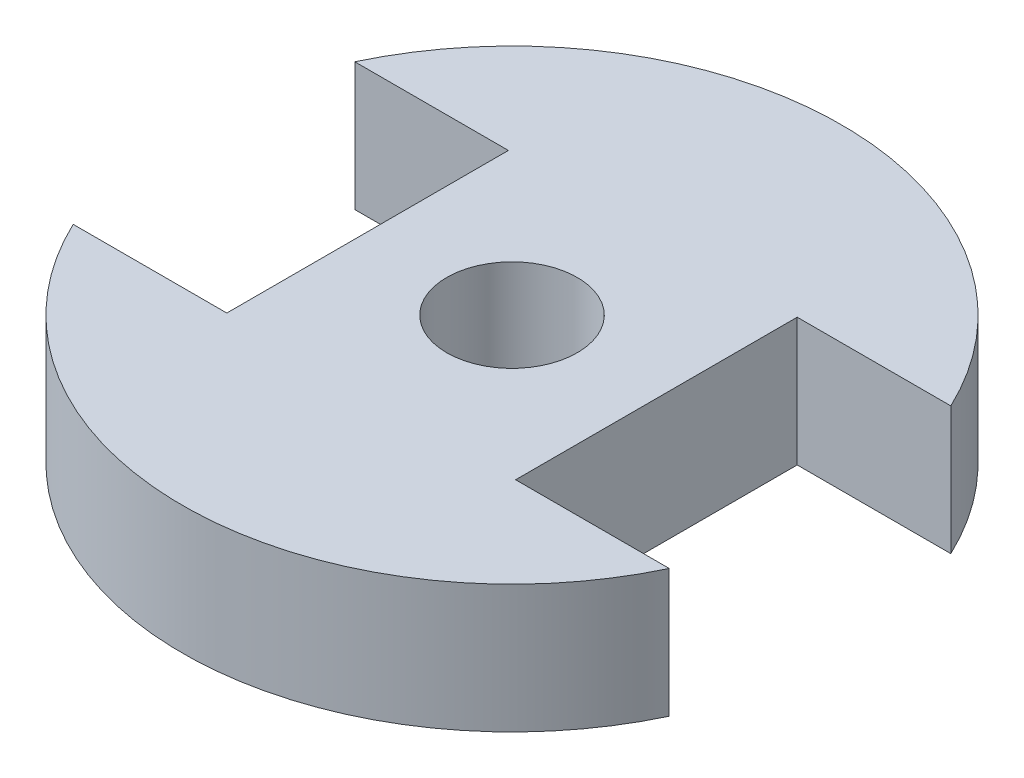
ISO-10303-21;
HEADER;
FILE_DESCRIPTION(('STEP AP214'),'2;1');
FILE_NAME('part.step','',(''),(''),'','','');
FILE_SCHEMA(('AUTOMOTIVE_DESIGN { 1 0 10303 214 1 1 1 1 }'));
ENDSEC;
DATA;
#1=APPLICATION_CONTEXT('core data for automotive mechanical design processes');
#2=APPLICATION_PROTOCOL_DEFINITION('international standard','automotive_design',2000,#1);
#3=PRODUCT_CONTEXT('',#1,'mechanical');
#4=PRODUCT('Part','Part','',(#3));
#5=PRODUCT_RELATED_PRODUCT_CATEGORY('part','',(#4));
#6=PRODUCT_DEFINITION_FORMATION('','',#4);
#7=PRODUCT_DEFINITION_CONTEXT('part definition',#1,'design');
#8=PRODUCT_DEFINITION('design','',#6,#7);
#9=PRODUCT_DEFINITION_SHAPE('','',#8);
#10=(LENGTH_UNIT() NAMED_UNIT(*) SI_UNIT(.MILLI.,.METRE.));
#11=(NAMED_UNIT(*) PLANE_ANGLE_UNIT() SI_UNIT($,.RADIAN.));
#12=(NAMED_UNIT(*) SI_UNIT($,.STERADIAN.) SOLID_ANGLE_UNIT());
#13=UNCERTAINTY_MEASURE_WITH_UNIT(LENGTH_MEASURE(1.E-05),#10,'distance_accuracy_value','');
#14=(GEOMETRIC_REPRESENTATION_CONTEXT(3) GLOBAL_UNCERTAINTY_ASSIGNED_CONTEXT((#13)) GLOBAL_UNIT_ASSIGNED_CONTEXT((#10,
#11,#12)) REPRESENTATION_CONTEXT('',''));
#15=CARTESIAN_POINT('',(0.,0.,0.));
#16=DIRECTION('',(0.,0.,1.));
#17=DIRECTION('',(1.,0.,0.));
#18=AXIS2_PLACEMENT_3D('',#15,#16,#17);
#19=CARTESIAN_POINT('',(0.,5.,0.));
#20=DIRECTION('',(0.,1.,0.));
#21=DIRECTION('',(0.,0.,1.));
#22=AXIS2_PLACEMENT_3D('',#19,#20,#21);
#23=PLANE('',#22);
#24=CARTESIAN_POINT('',(0.,5.,0.));
#25=DIRECTION('',(0.,1.,0.));
#26=DIRECTION('',(0.,0.,1.));
#27=AXIS2_PLACEMENT_3D('',#24,#25,#26);
#28=CIRCLE('',#27,12.875);
#29=CARTESIAN_POINT('',(11.6411178586938,5.,-5.5));
#30=VERTEX_POINT('',#29);
#31=CARTESIAN_POINT('',(-11.6411178586938,5.,-5.5));
#32=VERTEX_POINT('',#31);
#33=EDGE_CURVE('E145',#30,#32,#28,.T.);
#34=ORIENTED_EDGE('',*,*,#33,.T.);
#35=DIRECTION('',(1.,0.,0.));
#36=VECTOR('',#35,1.);
#37=CARTESIAN_POINT('',(-11.6411178586938,5.,-5.5));
#38=LINE('',#37,#36);
#39=CARTESIAN_POINT('',(-5.64111785869381,5.,-5.5));
#40=VERTEX_POINT('',#39);
#41=EDGE_CURVE('E93',#32,#40,#38,.T.);
#42=ORIENTED_EDGE('',*,*,#41,.T.);
#43=DIRECTION('',(0.,0.,1.));
#44=VECTOR('',#43,1.);
#45=CARTESIAN_POINT('',(-5.64111785869381,5.,-5.5));
#46=LINE('',#45,#44);
#47=CARTESIAN_POINT('',(-5.64111785869381,5.,5.5));
#48=VERTEX_POINT('',#47);
#49=EDGE_CURVE('E160',#40,#48,#46,.T.);
#50=ORIENTED_EDGE('',*,*,#49,.T.);
#51=DIRECTION('',(-1.,0.,0.));
#52=VECTOR('',#51,1.);
#53=CARTESIAN_POINT('',(-5.64111785869381,5.,5.5));
#54=LINE('',#53,#52);
#55=CARTESIAN_POINT('',(-11.6411178586938,5.,5.5));
#56=VERTEX_POINT('',#55);
#57=EDGE_CURVE('E173',#48,#56,#54,.T.);
#58=ORIENTED_EDGE('',*,*,#57,.T.);
#59=CARTESIAN_POINT('',(0.,5.,0.));
#60=DIRECTION('',(0.,1.,0.));
#61=DIRECTION('',(0.,0.,1.));
#62=AXIS2_PLACEMENT_3D('',#59,#60,#61);
#63=CIRCLE('',#62,12.875);
#64=CARTESIAN_POINT('',(11.6411178586938,5.,5.5));
#65=VERTEX_POINT('',#64);
#66=EDGE_CURVE('E112',#56,#65,#63,.T.);
#67=ORIENTED_EDGE('',*,*,#66,.T.);
#68=DIRECTION('',(-1.,0.,0.));
#69=VECTOR('',#68,1.);
#70=CARTESIAN_POINT('',(5.64111785869382,5.,5.5));
#71=LINE('',#70,#69);
#72=CARTESIAN_POINT('',(5.64111785869382,5.,5.5));
#73=VERTEX_POINT('',#72);
#74=EDGE_CURVE('E106',#65,#73,#71,.T.);
#75=ORIENTED_EDGE('',*,*,#74,.T.);
#76=DIRECTION('',(0.,0.,-1.));
#77=VECTOR('',#76,1.);
#78=CARTESIAN_POINT('',(5.64111785869382,5.,-5.5));
#79=LINE('',#78,#77);
#80=CARTESIAN_POINT('',(5.64111785869382,5.,-5.5));
#81=VERTEX_POINT('',#80);
#82=EDGE_CURVE('E110',#73,#81,#79,.T.);
#83=ORIENTED_EDGE('',*,*,#82,.T.);
#84=DIRECTION('',(1.,0.,0.));
#85=VECTOR('',#84,1.);
#86=CARTESIAN_POINT('',(11.6411178586938,5.,-5.5));
#87=LINE('',#86,#85);
#88=EDGE_CURVE('E50',#81,#30,#87,.T.);
#89=ORIENTED_EDGE('',*,*,#88,.T.);
#90=EDGE_LOOP('',(#34,#42,#50,#58,#67,#75,#83,#89));
#91=FACE_BOUND('',#90,.T.);
#92=CARTESIAN_POINT('',(0.,5.,0.));
#93=DIRECTION('',(0.,1.,0.));
#94=DIRECTION('',(0.,0.,1.));
#95=AXIS2_PLACEMENT_3D('',#92,#93,#94);
#96=CIRCLE('',#95,2.55);
#97=CARTESIAN_POINT('',(0.,5.,2.55));
#98=VERTEX_POINT('',#97);
#99=EDGE_CURVE('E134',#98,#98,#96,.T.);
#100=ORIENTED_EDGE('',*,*,#99,.F.);
#101=EDGE_LOOP('',(#100));
#102=FACE_BOUND('',#101,.T.);
#103=ADVANCED_FACE('F33',(#91,#102),#23,.T.);
#104=CARTESIAN_POINT('',(0.,0.,0.));
#105=DIRECTION('',(0.,1.,0.));
#106=DIRECTION('',(0.,0.,1.));
#107=AXIS2_PLACEMENT_3D('',#104,#105,#106);
#108=PLANE('',#107);
#109=CARTESIAN_POINT('',(0.,0.,0.));
#110=DIRECTION('',(0.,1.,0.));
#111=DIRECTION('',(0.,0.,1.));
#112=AXIS2_PLACEMENT_3D('',#109,#110,#111);
#113=CIRCLE('',#112,12.875);
#114=CARTESIAN_POINT('',(11.6411178586938,0.,-5.5));
#115=VERTEX_POINT('',#114);
#116=CARTESIAN_POINT('',(-11.6411178586938,0.,-5.5));
#117=VERTEX_POINT('',#116);
#118=EDGE_CURVE('E130',#115,#117,#113,.T.);
#119=ORIENTED_EDGE('',*,*,#118,.F.);
#120=DIRECTION('',(1.,0.,0.));
#121=VECTOR('',#120,1.);
#122=CARTESIAN_POINT('',(11.6411178586938,0.,-5.5));
#123=LINE('',#122,#121);
#124=CARTESIAN_POINT('',(5.64111785869382,0.,-5.5));
#125=VERTEX_POINT('',#124);
#126=EDGE_CURVE('E85',#125,#115,#123,.T.);
#127=ORIENTED_EDGE('',*,*,#126,.F.);
#128=DIRECTION('',(0.,0.,-1.));
#129=VECTOR('',#128,1.);
#130=CARTESIAN_POINT('',(5.64111785869382,0.,-5.5));
#131=LINE('',#130,#129);
#132=CARTESIAN_POINT('',(5.64111785869382,0.,5.5));
#133=VERTEX_POINT('',#132);
#134=EDGE_CURVE('E79',#133,#125,#131,.T.);
#135=ORIENTED_EDGE('',*,*,#134,.F.);
#136=DIRECTION('',(-1.,0.,0.));
#137=VECTOR('',#136,1.);
#138=CARTESIAN_POINT('',(5.64111785869382,0.,5.5));
#139=LINE('',#138,#137);
#140=CARTESIAN_POINT('',(11.6411178586938,0.,5.5));
#141=VERTEX_POINT('',#140);
#142=EDGE_CURVE('E120',#141,#133,#139,.T.);
#143=ORIENTED_EDGE('',*,*,#142,.F.);
#144=CARTESIAN_POINT('',(0.,0.,0.));
#145=DIRECTION('',(0.,1.,0.));
#146=DIRECTION('',(0.,0.,1.));
#147=AXIS2_PLACEMENT_3D('',#144,#145,#146);
#148=CIRCLE('',#147,12.875);
#149=CARTESIAN_POINT('',(-11.6411178586938,0.,5.5));
#150=VERTEX_POINT('',#149);
#151=EDGE_CURVE('E140',#150,#141,#148,.T.);
#152=ORIENTED_EDGE('',*,*,#151,.F.);
#153=DIRECTION('',(-1.,0.,0.));
#154=VECTOR('',#153,1.);
#155=CARTESIAN_POINT('',(-5.64111785869381,0.,5.5));
#156=LINE('',#155,#154);
#157=CARTESIAN_POINT('',(-5.64111785869381,0.,5.5));
#158=VERTEX_POINT('',#157);
#159=EDGE_CURVE('E138',#158,#150,#156,.T.);
#160=ORIENTED_EDGE('',*,*,#159,.F.);
#161=DIRECTION('',(0.,0.,1.));
#162=VECTOR('',#161,1.);
#163=CARTESIAN_POINT('',(-5.64111785869381,0.,-5.5));
#164=LINE('',#163,#162);
#165=CARTESIAN_POINT('',(-5.64111785869381,0.,-5.5));
#166=VERTEX_POINT('',#165);
#167=EDGE_CURVE('E136',#166,#158,#164,.T.);
#168=ORIENTED_EDGE('',*,*,#167,.F.);
#169=DIRECTION('',(1.,0.,0.));
#170=VECTOR('',#169,1.);
#171=CARTESIAN_POINT('',(-11.6411178586938,0.,-5.5));
#172=LINE('',#171,#170);
#173=EDGE_CURVE('E133',#117,#166,#172,.T.);
#174=ORIENTED_EDGE('',*,*,#173,.F.);
#175=EDGE_LOOP('',(#119,#127,#135,#143,#152,#160,#168,#174));
#176=FACE_BOUND('',#175,.T.);
#177=CARTESIAN_POINT('',(0.,0.,0.));
#178=DIRECTION('',(0.,1.,0.));
#179=DIRECTION('',(0.,0.,1.));
#180=AXIS2_PLACEMENT_3D('',#177,#178,#179);
#181=CIRCLE('',#180,2.55);
#182=CARTESIAN_POINT('',(0.,0.,2.55));
#183=VERTEX_POINT('',#182);
#184=EDGE_CURVE('E179',#183,#183,#181,.T.);
#185=ORIENTED_EDGE('',*,*,#184,.T.);
#186=EDGE_LOOP('',(#185));
#187=FACE_BOUND('',#186,.T.);
#188=ADVANCED_FACE('F164',(#176,#187),#108,.F.);
#189=CARTESIAN_POINT('',(0.,5.,0.));
#190=DIRECTION('',(0.,-1.,0.));
#191=DIRECTION('',(0.,0.,-1.));
#192=AXIS2_PLACEMENT_3D('',#189,#190,#191);
#193=CYLINDRICAL_SURFACE('',#192,12.875);
#194=ORIENTED_EDGE('',*,*,#118,.T.);
#195=DIRECTION('',(0.,-1.,0.));
#196=VECTOR('',#195,1.);
#197=CARTESIAN_POINT('',(-11.6411178586938,5.,-5.5));
#198=LINE('',#197,#196);
#199=EDGE_CURVE('E11',#32,#117,#198,.T.);
#200=ORIENTED_EDGE('',*,*,#199,.F.);
#201=ORIENTED_EDGE('',*,*,#33,.F.);
#202=DIRECTION('',(0.,-1.,0.));
#203=VECTOR('',#202,1.);
#204=CARTESIAN_POINT('',(11.6411178586938,5.,-5.5));
#205=LINE('',#204,#203);
#206=EDGE_CURVE('E126',#30,#115,#205,.T.);
#207=ORIENTED_EDGE('',*,*,#206,.T.);
#208=EDGE_LOOP('',(#194,#200,#201,#207));
#209=FACE_BOUND('',#208,.T.);
#210=ADVANCED_FACE('F35',(#209),#193,.T.);
#211=CARTESIAN_POINT('',(-11.6411178586938,5.,-5.5));
#212=DIRECTION('',(0.,0.,-1.));
#213=DIRECTION('',(-1.,0.,0.));
#214=AXIS2_PLACEMENT_3D('',#211,#212,#213);
#215=PLANE('',#214);
#216=ORIENTED_EDGE('',*,*,#173,.T.);
#217=DIRECTION('',(0.,-1.,0.));
#218=VECTOR('',#217,1.);
#219=CARTESIAN_POINT('',(-5.64111785869381,5.,-5.5));
#220=LINE('',#219,#218);
#221=EDGE_CURVE('E42',#40,#166,#220,.T.);
#222=ORIENTED_EDGE('',*,*,#221,.F.);
#223=ORIENTED_EDGE('',*,*,#41,.F.);
#224=ORIENTED_EDGE('',*,*,#199,.T.);
#225=EDGE_LOOP('',(#216,#222,#223,#224));
#226=FACE_BOUND('',#225,.T.);
#227=ADVANCED_FACE('F207',(#226),#215,.F.);
#228=CARTESIAN_POINT('',(-5.64111785869381,5.,-5.5));
#229=DIRECTION('',(1.,0.,0.));
#230=DIRECTION('',(0.,0.,-1.));
#231=AXIS2_PLACEMENT_3D('',#228,#229,#230);
#232=PLANE('',#231);
#233=ORIENTED_EDGE('',*,*,#167,.T.);
#234=DIRECTION('',(0.,-1.,0.));
#235=VECTOR('',#234,1.);
#236=CARTESIAN_POINT('',(-5.64111785869381,5.,5.5));
#237=LINE('',#236,#235);
#238=EDGE_CURVE('E152',#48,#158,#237,.T.);
#239=ORIENTED_EDGE('',*,*,#238,.F.);
#240=ORIENTED_EDGE('',*,*,#49,.F.);
#241=ORIENTED_EDGE('',*,*,#221,.T.);
#242=EDGE_LOOP('',(#233,#239,#240,#241));
#243=FACE_BOUND('',#242,.T.);
#244=ADVANCED_FACE('F158',(#243),#232,.F.);
#245=CARTESIAN_POINT('',(-5.64111785869381,5.,5.5));
#246=DIRECTION('',(0.,0.,1.));
#247=DIRECTION('',(1.,0.,0.));
#248=AXIS2_PLACEMENT_3D('',#245,#246,#247);
#249=PLANE('',#248);
#250=ORIENTED_EDGE('',*,*,#159,.T.);
#251=DIRECTION('',(0.,-1.,0.));
#252=VECTOR('',#251,1.);
#253=CARTESIAN_POINT('',(-11.6411178586938,5.,5.5));
#254=LINE('',#253,#252);
#255=EDGE_CURVE('E149',#56,#150,#254,.T.);
#256=ORIENTED_EDGE('',*,*,#255,.F.);
#257=ORIENTED_EDGE('',*,*,#57,.F.);
#258=ORIENTED_EDGE('',*,*,#238,.T.);
#259=EDGE_LOOP('',(#250,#256,#257,#258));
#260=FACE_BOUND('',#259,.T.);
#261=ADVANCED_FACE('F169',(#260),#249,.F.);
#262=CARTESIAN_POINT('',(0.,5.,0.));
#263=DIRECTION('',(0.,-1.,0.));
#264=DIRECTION('',(0.,0.,-1.));
#265=AXIS2_PLACEMENT_3D('',#262,#263,#264);
#266=CYLINDRICAL_SURFACE('',#265,12.875);
#267=ORIENTED_EDGE('',*,*,#151,.T.);
#268=DIRECTION('',(0.,-1.,0.));
#269=VECTOR('',#268,1.);
#270=CARTESIAN_POINT('',(11.6411178586938,5.,5.5));
#271=LINE('',#270,#269);
#272=EDGE_CURVE('E121',#65,#141,#271,.T.);
#273=ORIENTED_EDGE('',*,*,#272,.F.);
#274=ORIENTED_EDGE('',*,*,#66,.F.);
#275=ORIENTED_EDGE('',*,*,#255,.T.);
#276=EDGE_LOOP('',(#267,#273,#274,#275));
#277=FACE_BOUND('',#276,.T.);
#278=ADVANCED_FACE('F172',(#277),#266,.T.);
#279=CARTESIAN_POINT('',(5.64111785869382,5.,5.5));
#280=DIRECTION('',(0.,0.,1.));
#281=DIRECTION('',(1.,0.,0.));
#282=AXIS2_PLACEMENT_3D('',#279,#280,#281);
#283=PLANE('',#282);
#284=ORIENTED_EDGE('',*,*,#142,.T.);
#285=DIRECTION('',(0.,-1.,0.));
#286=VECTOR('',#285,1.);
#287=CARTESIAN_POINT('',(5.64111785869382,5.,5.5));
#288=LINE('',#287,#286);
#289=EDGE_CURVE('E117',#73,#133,#288,.T.);
#290=ORIENTED_EDGE('',*,*,#289,.F.);
#291=ORIENTED_EDGE('',*,*,#74,.F.);
#292=ORIENTED_EDGE('',*,*,#272,.T.);
#293=EDGE_LOOP('',(#284,#290,#291,#292));
#294=FACE_BOUND('',#293,.T.);
#295=ADVANCED_FACE('F118',(#294),#283,.F.);
#296=CARTESIAN_POINT('',(5.64111785869382,5.,-5.5));
#297=DIRECTION('',(-1.,0.,0.));
#298=DIRECTION('',(0.,0.,1.));
#299=AXIS2_PLACEMENT_3D('',#296,#297,#298);
#300=PLANE('',#299);
#301=ORIENTED_EDGE('',*,*,#134,.T.);
#302=DIRECTION('',(0.,-1.,0.));
#303=VECTOR('',#302,1.);
#304=CARTESIAN_POINT('',(5.64111785869382,5.,-5.5));
#305=LINE('',#304,#303);
#306=EDGE_CURVE('E122',#81,#125,#305,.T.);
#307=ORIENTED_EDGE('',*,*,#306,.F.);
#308=ORIENTED_EDGE('',*,*,#82,.F.);
#309=ORIENTED_EDGE('',*,*,#289,.T.);
#310=EDGE_LOOP('',(#301,#307,#308,#309));
#311=FACE_BOUND('',#310,.T.);
#312=ADVANCED_FACE('F124',(#311),#300,.F.);
#313=CARTESIAN_POINT('',(11.6411178586938,5.,-5.5));
#314=DIRECTION('',(0.,0.,-1.));
#315=DIRECTION('',(-1.,0.,0.));
#316=AXIS2_PLACEMENT_3D('',#313,#314,#315);
#317=PLANE('',#316);
#318=ORIENTED_EDGE('',*,*,#126,.T.);
#319=ORIENTED_EDGE('',*,*,#206,.F.);
#320=ORIENTED_EDGE('',*,*,#88,.F.);
#321=ORIENTED_EDGE('',*,*,#306,.T.);
#322=EDGE_LOOP('',(#318,#319,#320,#321));
#323=FACE_BOUND('',#322,.T.);
#324=ADVANCED_FACE('F195',(#323),#317,.F.);
#325=CARTESIAN_POINT('',(0.,5.,0.));
#326=DIRECTION('',(0.,-1.,0.));
#327=DIRECTION('',(0.,0.,-1.));
#328=AXIS2_PLACEMENT_3D('',#325,#326,#327);
#329=CYLINDRICAL_SURFACE('',#328,2.55);
#330=ORIENTED_EDGE('',*,*,#99,.T.);
#331=EDGE_LOOP('',(#330));
#332=FACE_BOUND('',#331,.T.);
#333=ORIENTED_EDGE('',*,*,#184,.F.);
#334=EDGE_LOOP('',(#333));
#335=FACE_BOUND('',#334,.T.);
#336=ADVANCED_FACE('F185',(#332,#335),#329,.F.);
#337=CLOSED_SHELL('',(#103,#188,#210,#227,#244,#261,#278,#295,#312,#324,#336));
#338=MANIFOLD_SOLID_BREP('B2',#337);
#339=ADVANCED_BREP_SHAPE_REPRESENTATION('',(#18,#338),#14);
#340=SHAPE_DEFINITION_REPRESENTATION(#9,#339);
ENDSEC;
END-ISO-10303-21;
